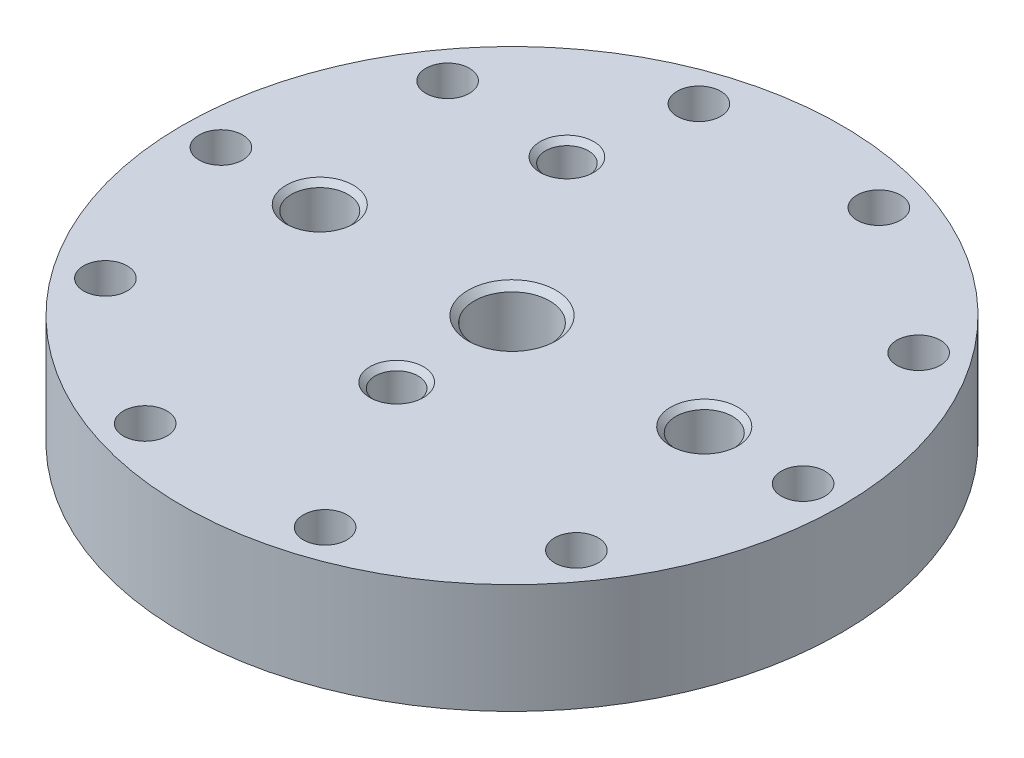
ISO-10303-21;
HEADER;
FILE_DESCRIPTION(('STEP AP214'),'2;1');
FILE_NAME('part.step','',(''),(''),'','','');
FILE_SCHEMA(('AUTOMOTIVE_DESIGN { 1 0 10303 214 1 1 1 1 }'));
ENDSEC;
DATA;
#1=APPLICATION_CONTEXT('core data for automotive mechanical design processes');
#2=APPLICATION_PROTOCOL_DEFINITION('international standard','automotive_design',2000,#1);
#3=PRODUCT_CONTEXT('',#1,'mechanical');
#4=PRODUCT('Part','Part','',(#3));
#5=PRODUCT_RELATED_PRODUCT_CATEGORY('part','',(#4));
#6=PRODUCT_DEFINITION_FORMATION('','',#4);
#7=PRODUCT_DEFINITION_CONTEXT('part definition',#1,'design');
#8=PRODUCT_DEFINITION('design','',#6,#7);
#9=PRODUCT_DEFINITION_SHAPE('','',#8);
#10=(LENGTH_UNIT() NAMED_UNIT(*) SI_UNIT(.MILLI.,.METRE.));
#11=(NAMED_UNIT(*) PLANE_ANGLE_UNIT() SI_UNIT($,.RADIAN.));
#12=(NAMED_UNIT(*) SI_UNIT($,.STERADIAN.) SOLID_ANGLE_UNIT());
#13=UNCERTAINTY_MEASURE_WITH_UNIT(LENGTH_MEASURE(1.E-05),#10,'distance_accuracy_value','');
#14=(GEOMETRIC_REPRESENTATION_CONTEXT(3) GLOBAL_UNCERTAINTY_ASSIGNED_CONTEXT((#13)) GLOBAL_UNIT_ASSIGNED_CONTEXT((#10,
#11,#12)) REPRESENTATION_CONTEXT('',''));
#15=CARTESIAN_POINT('',(0.,0.,0.));
#16=DIRECTION('',(0.,0.,1.));
#17=DIRECTION('',(1.,0.,0.));
#18=AXIS2_PLACEMENT_3D('',#15,#16,#17);
#19=CARTESIAN_POINT('',(-76.2,-25.4,0.));
#20=DIRECTION('',(0.,-1.,0.));
#21=DIRECTION('',(1.,0.,0.));
#22=AXIS2_PLACEMENT_3D('',#19,#20,#21);
#23=PLANE('',#22);
#24=CARTESIAN_POINT('',(-20.7999338913771,-25.4,64.015614111827));
#25=DIRECTION('',(0.,1.,0.));
#26=DIRECTION('',(0.,0.,1.));
#27=AXIS2_PLACEMENT_3D('',#24,#25,#26);
#28=CIRCLE('',#27,5.04189999999999);
#29=CARTESIAN_POINT('',(-20.7999338913771,-25.4,69.057514111827));
#30=VERTEX_POINT('',#29);
#31=EDGE_CURVE('E311',#30,#30,#28,.T.);
#32=ORIENTED_EDGE('',*,*,#31,.T.);
#33=EDGE_LOOP('',(#32));
#34=FACE_BOUND('',#33,.T.);
#35=CARTESIAN_POINT('',(-54.4549338913774,-25.4,39.5638253318068));
#36=DIRECTION('',(0.,1.,0.));
#37=DIRECTION('',(0.,0.,1.));
#38=AXIS2_PLACEMENT_3D('',#35,#36,#37);
#39=CIRCLE('',#38,5.04189999999999);
#40=CARTESIAN_POINT('',(-54.4549338913774,-25.4,44.6057253318068));
#41=VERTEX_POINT('',#40);
#42=EDGE_CURVE('E318',#41,#41,#39,.T.);
#43=ORIENTED_EDGE('',*,*,#42,.T.);
#44=EDGE_LOOP('',(#43));
#45=FACE_BOUND('',#44,.T.);
#46=CARTESIAN_POINT('',(-67.31,-25.4,0.));
#47=DIRECTION('',(0.,1.,0.));
#48=DIRECTION('',(0.,0.,1.));
#49=AXIS2_PLACEMENT_3D('',#46,#47,#48);
#50=CIRCLE('',#49,5.04189999999999);
#51=CARTESIAN_POINT('',(-67.31,-25.4,5.04189999999999));
#52=VERTEX_POINT('',#51);
#53=EDGE_CURVE('E326',#52,#52,#50,.T.);
#54=ORIENTED_EDGE('',*,*,#53,.T.);
#55=EDGE_LOOP('',(#54));
#56=FACE_BOUND('',#55,.T.);
#57=CARTESIAN_POINT('',(-54.4549338913779,-25.4,-39.5638253318061));
#58=DIRECTION('',(0.,1.,0.));
#59=DIRECTION('',(0.,0.,1.));
#60=AXIS2_PLACEMENT_3D('',#57,#58,#59);
#61=CIRCLE('',#60,5.04189999999999);
#62=CARTESIAN_POINT('',(-54.4549338913779,-25.4,-34.5219253318061));
#63=VERTEX_POINT('',#62);
#64=EDGE_CURVE('E334',#63,#63,#61,.T.);
#65=ORIENTED_EDGE('',*,*,#64,.T.);
#66=EDGE_LOOP('',(#65));
#67=FACE_BOUND('',#66,.T.);
#68=CARTESIAN_POINT('',(-20.799933891378,-25.4,-64.0156141118267));
#69=DIRECTION('',(0.,1.,0.));
#70=DIRECTION('',(0.,0.,1.));
#71=AXIS2_PLACEMENT_3D('',#68,#69,#70);
#72=CIRCLE('',#71,5.04189999999999);
#73=CARTESIAN_POINT('',(-20.799933891378,-25.4,-58.9737141118267));
#74=VERTEX_POINT('',#73);
#75=EDGE_CURVE('E342',#74,#74,#72,.T.);
#76=ORIENTED_EDGE('',*,*,#75,.T.);
#77=EDGE_LOOP('',(#76));
#78=FACE_BOUND('',#77,.T.);
#79=CARTESIAN_POINT('',(20.7999338913775,-25.4,-64.0156141118268));
#80=DIRECTION('',(0.,1.,0.));
#81=DIRECTION('',(0.,0.,1.));
#82=AXIS2_PLACEMENT_3D('',#79,#80,#81);
#83=CIRCLE('',#82,5.04189999999999);
#84=CARTESIAN_POINT('',(20.7999338913775,-25.4,-58.9737141118269));
#85=VERTEX_POINT('',#84);
#86=EDGE_CURVE('E350',#85,#85,#83,.T.);
#87=ORIENTED_EDGE('',*,*,#86,.T.);
#88=EDGE_LOOP('',(#87));
#89=FACE_BOUND('',#88,.T.);
#90=CARTESIAN_POINT('',(54.4549338913777,-25.4,-39.5638253318064));
#91=DIRECTION('',(0.,1.,0.));
#92=DIRECTION('',(0.,0.,1.));
#93=AXIS2_PLACEMENT_3D('',#90,#91,#92);
#94=CIRCLE('',#93,5.04189999999999);
#95=CARTESIAN_POINT('',(54.4549338913777,-25.4,-34.5219253318065));
#96=VERTEX_POINT('',#95);
#97=EDGE_CURVE('E358',#96,#96,#94,.T.);
#98=ORIENTED_EDGE('',*,*,#97,.T.);
#99=EDGE_LOOP('',(#98));
#100=FACE_BOUND('',#99,.T.);
#101=CARTESIAN_POINT('',(67.31,-25.4,0.));
#102=DIRECTION('',(0.,1.,0.));
#103=DIRECTION('',(0.,0.,1.));
#104=AXIS2_PLACEMENT_3D('',#101,#102,#103);
#105=CIRCLE('',#104,5.04189999999999);
#106=CARTESIAN_POINT('',(67.31,-25.4,5.04189999999999));
#107=VERTEX_POINT('',#106);
#108=EDGE_CURVE('E366',#107,#107,#105,.T.);
#109=ORIENTED_EDGE('',*,*,#108,.T.);
#110=EDGE_LOOP('',(#109));
#111=FACE_BOUND('',#110,.T.);
#112=CARTESIAN_POINT('',(0.,-25.4,0.));
#113=DIRECTION('',(0.,1.,0.));
#114=DIRECTION('',(-1.,0.,0.));
#115=AXIS2_PLACEMENT_3D('',#112,#113,#114);
#116=CIRCLE('',#115,58.8899);
#117=CARTESIAN_POINT('',(-58.8899,-25.4,0.));
#118=VERTEX_POINT('',#117);
#119=EDGE_CURVE('E89',#118,#118,#116,.T.);
#120=ORIENTED_EDGE('',*,*,#119,.T.);
#121=EDGE_LOOP('',(#120));
#122=FACE_BOUND('',#121,.T.);
#123=CARTESIAN_POINT('',(0.,-25.4,0.));
#124=DIRECTION('',(0.,1.,0.));
#125=DIRECTION('',(-1.,0.,0.));
#126=AXIS2_PLACEMENT_3D('',#123,#124,#125);
#127=CIRCLE('',#126,76.2);
#128=CARTESIAN_POINT('',(-76.2,-25.4,0.));
#129=VERTEX_POINT('',#128);
#130=EDGE_CURVE('E93',#129,#129,#127,.T.);
#131=ORIENTED_EDGE('',*,*,#130,.F.);
#132=EDGE_LOOP('',(#131));
#133=FACE_BOUND('',#132,.T.);
#134=CARTESIAN_POINT('',(20.7999338913784,-25.4,64.0156141118266));
#135=DIRECTION('',(0.,1.,0.));
#136=DIRECTION('',(0.,0.,1.));
#137=AXIS2_PLACEMENT_3D('',#134,#135,#136);
#138=CIRCLE('',#137,5.04189999999999);
#139=CARTESIAN_POINT('',(20.7999338913784,-25.4,69.0575141118265));
#140=VERTEX_POINT('',#139);
#141=EDGE_CURVE('E288',#140,#140,#138,.T.);
#142=ORIENTED_EDGE('',*,*,#141,.T.);
#143=EDGE_LOOP('',(#142));
#144=FACE_BOUND('',#143,.T.);
#145=CARTESIAN_POINT('',(54.4549338913782,-25.4,39.5638253318057));
#146=DIRECTION('',(0.,1.,0.));
#147=DIRECTION('',(0.,0.,1.));
#148=AXIS2_PLACEMENT_3D('',#145,#146,#147);
#149=CIRCLE('',#148,5.04189999999999);
#150=CARTESIAN_POINT('',(54.4549338913782,-25.4,44.6057253318056));
#151=VERTEX_POINT('',#150);
#152=EDGE_CURVE('E291',#151,#151,#149,.T.);
#153=ORIENTED_EDGE('',*,*,#152,.T.);
#154=EDGE_LOOP('',(#153));
#155=FACE_BOUND('',#154,.T.);
#156=ADVANCED_FACE('F41',(#34,#45,#56,#67,#78,#89,#100,#111,#122,#133,#144,#155),#23,.T.);
#157=CARTESIAN_POINT('',(-54.8259,-25.4,0.));
#158=DIRECTION('',(0.,-1.,0.));
#159=DIRECTION('',(1.,0.,0.));
#160=AXIS2_PLACEMENT_3D('',#157,#158,#159);
#161=PLANE('',#160);
#162=CARTESIAN_POINT('',(-25.4,-25.4,-38.1));
#163=DIRECTION('',(0.,1.,0.));
#164=DIRECTION('',(0.,0.,1.));
#165=AXIS2_PLACEMENT_3D('',#162,#163,#164);
#166=CIRCLE('',#165,4.96062);
#167=CARTESIAN_POINT('',(-25.4,-25.4,-33.13938));
#168=VERTEX_POINT('',#167);
#169=EDGE_CURVE('E463',#168,#168,#166,.T.);
#170=ORIENTED_EDGE('',*,*,#169,.T.);
#171=EDGE_LOOP('',(#170));
#172=FACE_BOUND('',#171,.T.);
#173=CARTESIAN_POINT('',(-44.45,-25.4,0.));
#174=DIRECTION('',(0.,1.,0.));
#175=DIRECTION('',(0.,0.,1.));
#176=AXIS2_PLACEMENT_3D('',#173,#174,#175);
#177=CIRCLE('',#176,6.54811999999998);
#178=CARTESIAN_POINT('',(-44.45,-25.4,6.54811999999998));
#179=VERTEX_POINT('',#178);
#180=EDGE_CURVE('E378',#179,#179,#177,.T.);
#181=ORIENTED_EDGE('',*,*,#180,.T.);
#182=EDGE_LOOP('',(#181));
#183=FACE_BOUND('',#182,.T.);
#184=CARTESIAN_POINT('',(44.45,-25.4,0.));
#185=DIRECTION('',(0.,1.,0.));
#186=DIRECTION('',(0.,0.,1.));
#187=AXIS2_PLACEMENT_3D('',#184,#185,#186);
#188=CIRCLE('',#187,6.54811999999998);
#189=CARTESIAN_POINT('',(44.45,-25.4,6.54811999999998));
#190=VERTEX_POINT('',#189);
#191=EDGE_CURVE('E78',#190,#190,#188,.T.);
#192=ORIENTED_EDGE('',*,*,#191,.T.);
#193=EDGE_LOOP('',(#192));
#194=FACE_BOUND('',#193,.T.);
#195=CARTESIAN_POINT('',(0.,-25.4,0.));
#196=DIRECTION('',(0.,1.,0.));
#197=DIRECTION('',(-1.,0.,0.));
#198=AXIS2_PLACEMENT_3D('',#195,#196,#197);
#199=CIRCLE('',#198,36.6649);
#200=CARTESIAN_POINT('',(-36.6649,-25.4,0.));
#201=VERTEX_POINT('',#200);
#202=EDGE_CURVE('E10',#201,#201,#199,.T.);
#203=ORIENTED_EDGE('',*,*,#202,.T.);
#204=EDGE_LOOP('',(#203));
#205=FACE_BOUND('',#204,.T.);
#206=CARTESIAN_POINT('',(0.,-25.4,0.));
#207=DIRECTION('',(0.,1.,0.));
#208=DIRECTION('',(-1.,0.,0.));
#209=AXIS2_PLACEMENT_3D('',#206,#207,#208);
#210=CIRCLE('',#209,54.8259);
#211=CARTESIAN_POINT('',(-54.8259,-25.4,0.));
#212=VERTEX_POINT('',#211);
#213=EDGE_CURVE('E62',#212,#212,#210,.T.);
#214=ORIENTED_EDGE('',*,*,#213,.F.);
#215=EDGE_LOOP('',(#214));
#216=FACE_BOUND('',#215,.T.);
#217=ADVANCED_FACE('F43',(#172,#183,#194,#205,#216),#161,.T.);
#218=CARTESIAN_POINT('',(0.,0.,0.));
#219=DIRECTION('',(0.,1.,0.));
#220=DIRECTION('',(-1.,0.,0.));
#221=AXIS2_PLACEMENT_3D('',#218,#219,#220);
#222=CYLINDRICAL_SURFACE('',#221,36.6649);
#223=CARTESIAN_POINT('',(0.,-22.7076,0.));
#224=DIRECTION('',(0.,1.,0.));
#225=DIRECTION('',(-1.,0.,0.));
#226=AXIS2_PLACEMENT_3D('',#223,#224,#225);
#227=CIRCLE('',#226,36.6649);
#228=CARTESIAN_POINT('',(-36.6649,-22.7076,0.));
#229=VERTEX_POINT('',#228);
#230=EDGE_CURVE('E50',#229,#229,#227,.T.);
#231=ORIENTED_EDGE('',*,*,#230,.T.);
#232=EDGE_LOOP('',(#231));
#233=FACE_BOUND('',#232,.T.);
#234=ORIENTED_EDGE('',*,*,#202,.F.);
#235=EDGE_LOOP('',(#234));
#236=FACE_BOUND('',#235,.T.);
#237=ADVANCED_FACE('F135',(#233,#236),#222,.F.);
#238=CARTESIAN_POINT('',(-36.6649,-22.7076,0.));
#239=DIRECTION('',(0.,-1.,0.));
#240=DIRECTION('',(1.,0.,0.));
#241=AXIS2_PLACEMENT_3D('',#238,#239,#240);
#242=PLANE('',#241);
#243=CARTESIAN_POINT('',(0.,-22.7076,0.));
#244=DIRECTION('',(0.,1.,0.));
#245=DIRECTION('',(-1.,0.,0.));
#246=AXIS2_PLACEMENT_3D('',#243,#244,#245);
#247=CIRCLE('',#246,32.6009);
#248=CARTESIAN_POINT('',(-32.6009,-22.7076,0.));
#249=VERTEX_POINT('',#248);
#250=EDGE_CURVE('E56',#249,#249,#247,.T.);
#251=ORIENTED_EDGE('',*,*,#250,.T.);
#252=EDGE_LOOP('',(#251));
#253=FACE_BOUND('',#252,.T.);
#254=ORIENTED_EDGE('',*,*,#230,.F.);
#255=EDGE_LOOP('',(#254));
#256=FACE_BOUND('',#255,.T.);
#257=ADVANCED_FACE('F120',(#253,#256),#242,.T.);
#258=CARTESIAN_POINT('',(0.,0.,0.));
#259=DIRECTION('',(0.,1.,0.));
#260=DIRECTION('',(-1.,0.,0.));
#261=AXIS2_PLACEMENT_3D('',#258,#259,#260);
#262=CYLINDRICAL_SURFACE('',#261,32.6009);
#263=CARTESIAN_POINT('',(0.,-25.4,0.));
#264=DIRECTION('',(0.,1.,0.));
#265=DIRECTION('',(-1.,0.,0.));
#266=AXIS2_PLACEMENT_3D('',#263,#264,#265);
#267=CIRCLE('',#266,32.6009);
#268=CARTESIAN_POINT('',(-32.6009,-25.4,0.));
#269=VERTEX_POINT('',#268);
#270=EDGE_CURVE('E113',#269,#269,#267,.T.);
#271=ORIENTED_EDGE('',*,*,#270,.T.);
#272=EDGE_LOOP('',(#271));
#273=FACE_BOUND('',#272,.T.);
#274=ORIENTED_EDGE('',*,*,#250,.F.);
#275=EDGE_LOOP('',(#274));
#276=FACE_BOUND('',#275,.T.);
#277=ADVANCED_FACE('F123',(#273,#276),#262,.T.);
#278=CARTESIAN_POINT('',(-32.6009,-25.4,0.));
#279=DIRECTION('',(0.,-1.,0.));
#280=DIRECTION('',(1.,0.,0.));
#281=AXIS2_PLACEMENT_3D('',#278,#279,#280);
#282=PLANE('',#281);
#283=CARTESIAN_POINT('',(0.,-25.4,0.));
#284=DIRECTION('',(0.,1.,0.));
#285=DIRECTION('',(-1.,0.,0.));
#286=AXIS2_PLACEMENT_3D('',#283,#284,#285);
#287=CIRCLE('',#286,31.0134);
#288=CARTESIAN_POINT('',(-31.0134,-25.4,0.));
#289=VERTEX_POINT('',#288);
#290=EDGE_CURVE('E109',#289,#289,#287,.T.);
#291=ORIENTED_EDGE('',*,*,#290,.T.);
#292=EDGE_LOOP('',(#291));
#293=FACE_BOUND('',#292,.T.);
#294=ORIENTED_EDGE('',*,*,#270,.F.);
#295=EDGE_LOOP('',(#294));
#296=FACE_BOUND('',#295,.T.);
#297=ADVANCED_FACE('F125',(#293,#296),#282,.T.);
#298=CARTESIAN_POINT('',(0.,0.,0.));
#299=DIRECTION('',(0.,1.,0.));
#300=DIRECTION('',(-1.,0.,0.));
#301=AXIS2_PLACEMENT_3D('',#298,#299,#300);
#302=CYLINDRICAL_SURFACE('',#301,31.0134);
#303=CARTESIAN_POINT('',(0.,-24.765,0.));
#304=DIRECTION('',(0.,1.,0.));
#305=DIRECTION('',(-1.,0.,0.));
#306=AXIS2_PLACEMENT_3D('',#303,#304,#305);
#307=CIRCLE('',#306,31.0134);
#308=CARTESIAN_POINT('',(-31.0134,-24.765,0.));
#309=VERTEX_POINT('',#308);
#310=EDGE_CURVE('E105',#309,#309,#307,.T.);
#311=ORIENTED_EDGE('',*,*,#310,.T.);
#312=EDGE_LOOP('',(#311));
#313=FACE_BOUND('',#312,.T.);
#314=ORIENTED_EDGE('',*,*,#290,.F.);
#315=EDGE_LOOP('',(#314));
#316=FACE_BOUND('',#315,.T.);
#317=ADVANCED_FACE('F132',(#313,#316),#302,.F.);
#318=CARTESIAN_POINT('',(0.,-24.765,0.));
#319=DIRECTION('',(0.,-1.,0.));
#320=DIRECTION('',(1.,0.,0.));
#321=AXIS2_PLACEMENT_3D('',#318,#319,#320);
#322=CONICAL_SURFACE('',#321,31.0134,1.32820785929553);
#323=CARTESIAN_POINT('',(-2.29230840469002,-23.1730578467666,24.4731943086755));
#324=CARTESIAN_POINT('',(-2.17148648907797,-23.1392092408368,24.3471283464952));
#325=CARTESIAN_POINT('',(-2.03986401074742,-23.1076504842786,24.2306545146319));
#326=CARTESIAN_POINT('',(-1.75828040896983,-23.050331005527,24.0204753739261));
#327=CARTESIAN_POINT('',(-1.60830442164899,-23.0245750314058,23.9267887055147));
#328=CARTESIAN_POINT('',(-1.29387707163479,-22.9799403986388,23.7652167316157));
#329=CARTESIAN_POINT('',(-1.12941187161248,-22.961068404617,23.6973564268028));
#330=CARTESIAN_POINT('',(-0.790838675048444,-22.9311116002462,23.5899468317939));
#331=CARTESIAN_POINT('',(-0.616733420442404,-22.9200245877534,23.5503895354443));
#332=CARTESIAN_POINT('',(-0.267974378561557,-22.9063235615343,23.5015417841057));
#333=CARTESIAN_POINT('',(-0.0934194884629469,-22.9035260327082,23.4915957617524));
#334=CARTESIAN_POINT('',(0.254894346947091,-22.9060152293265,23.5004576513084));
#335=CARTESIAN_POINT('',(0.428653340733291,-22.9113014556752,23.5192637880428));
#336=CARTESIAN_POINT('',(0.768175811843403,-22.9295878537462,23.5845430936928));
#337=CARTESIAN_POINT('',(0.934012414886317,-22.9424900595036,23.6306649197413));
#338=CARTESIAN_POINT('',(1.25546159470996,-22.9753493831642,23.7487391736544));
#339=CARTESIAN_POINT('',(1.41107369788114,-22.9953068276006,23.8206927970785));
#340=CARTESIAN_POINT('',(1.71016360369182,-23.0417734712303,23.9893538821773));
#341=CARTESIAN_POINT('',(1.85343510448676,-23.0683726254506,24.0864019230407));
#342=CARTESIAN_POINT('',(2.12172246757999,-23.1269238833087,24.301767881886));
#343=CARTESIAN_POINT('',(2.24673567298875,-23.1588767645541,24.4200888898651));
#344=CARTESIAN_POINT('',(2.47922755996233,-23.2280893531446,24.6787083235075));
#345=CARTESIAN_POINT('',(2.58601909877022,-23.265485906537,24.8195877502691));
#346=CARTESIAN_POINT('',(2.77451932254076,-23.3435008839784,25.1164251995025));
#347=CARTESIAN_POINT('',(2.85622379609809,-23.38411984754,25.272385747894));
#348=CARTESIAN_POINT('',(2.99485289023039,-23.4686638282191,25.6003420162143));
#349=CARTESIAN_POINT('',(3.05090535964434,-23.5126529390705,25.772690252568));
#350=CARTESIAN_POINT('',(3.1329412004748,-23.6014312902681,26.1242083224166));
#351=CARTESIAN_POINT('',(3.15892112239828,-23.6462206218058,26.3033789360431));
#352=CARTESIAN_POINT('',(3.18029964827097,-23.7361377161826,26.6667703776667));
#353=CARTESIAN_POINT('',(3.1751615958425,-23.781257935653,26.8510249568165));
#354=CARTESIAN_POINT('',(3.13304944785652,-23.8698283706818,27.2162806379597));
#355=CARTESIAN_POINT('',(3.09607485212284,-23.9132785599916,27.397281688792));
#356=CARTESIAN_POINT('',(2.99121868244847,-23.9972636714213,27.7503016855857));
#357=CARTESIAN_POINT('',(2.92341571290874,-24.0378057060487,27.9223422425952));
#358=CARTESIAN_POINT('',(2.75855697929699,-24.1150461325221,28.252739118955));
#359=CARTESIAN_POINT('',(2.66150371452105,-24.1517448523998,28.4110966059704));
#360=CARTESIAN_POINT('',(2.44272912190508,-24.2197097540351,28.7063785870681));
#361=CARTESIAN_POINT('',(2.3214975444225,-24.2510639028007,28.8436454899462));
#362=CARTESIAN_POINT('',(2.05656644547157,-24.308349912464,29.0958170552049));
#363=CARTESIAN_POINT('',(1.91287011435473,-24.334282542083,29.2107248877349));
#364=CARTESIAN_POINT('',(1.61098720776672,-24.3794715379119,29.4117887902025));
#365=CARTESIAN_POINT('',(1.45325795515829,-24.3988799038485,29.498597400542));
#366=CARTESIAN_POINT('',(1.12485855300491,-24.4314095136325,29.6444893016907));
#367=CARTESIAN_POINT('',(0.954190160270893,-24.4445316092334,29.7035763485904));
#368=CARTESIAN_POINT('',(0.608783590355999,-24.4639354547464,29.7910664754728));
#369=CARTESIAN_POINT('',(0.434216132062682,-24.4703605715953,29.8201125537052));
#370=CARTESIAN_POINT('',(0.0825694970300175,-24.4767116755465,29.848823582378));
#371=CARTESIAN_POINT('',(-0.0945094772550278,-24.4766381835604,29.8484908877449));
#372=CARTESIAN_POINT('',(-0.444090148449614,-24.4700317347515,29.8186264738164));
#373=CARTESIAN_POINT('',(-0.616620769770389,-24.4635698496211,29.7894160233155));
#374=CARTESIAN_POINT('',(-0.954230969301868,-24.4444520327182,29.703219575666));
#375=CARTESIAN_POINT('',(-1.11931059946631,-24.4317961441422,29.64623377222));
#376=CARTESIAN_POINT('',(-1.43794713184651,-24.4005493666126,29.5060749938696));
#377=CARTESIAN_POINT('',(-1.59146688981764,-24.3819402767098,29.422821721299));
#378=CARTESIAN_POINT('',(-1.8822998866556,-24.3392449253113,29.2327633249115));
#379=CARTESIAN_POINT('',(-2.01961207868009,-24.3151583103174,29.1259566810653));
#380=CARTESIAN_POINT('',(-2.27653630090332,-24.2616475519893,28.8901118218242));
#381=CARTESIAN_POINT('',(-2.39583148434271,-24.2321444862647,28.7607465287182));
#382=CARTESIAN_POINT('',(-2.61107155401954,-24.1687626216808,28.4848164226081));
#383=CARTESIAN_POINT('',(-2.70701378092179,-24.1348833251468,28.3382496535873));
#384=CARTESIAN_POINT('',(-2.87526668409187,-24.0626838948059,28.0284088643456));
#385=CARTESIAN_POINT('',(-2.94696126762735,-24.0242773282572,27.8648204688587));
#386=CARTESIAN_POINT('',(-3.06186541163014,-23.9446250057293,27.5285917986924));
#387=CARTESIAN_POINT('',(-3.10507237412049,-23.9033789911806,27.3559506999857));
#388=CARTESIAN_POINT('',(-3.16277621753206,-23.8180455255398,27.0021806359135));
#389=CARTESIAN_POINT('',(-3.17656999716895,-23.7739139459994,26.8209474951682));
#390=CARTESIAN_POINT('',(-3.17314523422187,-23.6848538644246,26.4589152860549));
#391=CARTESIAN_POINT('',(-3.15591623977573,-23.6399250988605,26.2781163845365));
#392=CARTESIAN_POINT('',(-3.09044899958947,-23.5498430035928,25.9193299763386));
#393=CARTESIAN_POINT('',(-3.04175330826662,-23.5046962745123,25.7414242924379));
#394=CARTESIAN_POINT('',(-2.91417904358197,-23.4162486062881,25.3964472069703));
#395=CARTESIAN_POINT('',(-2.83533373004028,-23.3729456914187,25.2293641030526));
#396=CARTESIAN_POINT('',(-2.67971417660669,-23.3031298480503,24.9625748888745));
#397=CARTESIAN_POINT('',(-2.61055563687989,-23.275724999231,24.8585865798521));
#398=CARTESIAN_POINT('',(-2.46022294935849,-23.2228393369198,24.6591491004832));
#399=CARTESIAN_POINT('',(-2.37904904208698,-23.1973584849288,24.5636997592652));
#400=CARTESIAN_POINT('',(-2.29230840469002,-23.1730578467666,24.4731943086755));
#401=B_SPLINE_CURVE_WITH_KNOTS('',3,(#323,#324,#325,#326,#327,#328,#329,#330,#331,#332,#333,
#334,#335,#336,#337,#338,#339,#340,#341,#342,#343,#344,#345,#346,#347,#348,#349,#350,#351,#352,
#353,#354,#355,#356,#357,#358,#359,#360,#361,#362,#363,#364,#365,#366,#367,#368,#369,#370,#371,
#372,#373,#374,#375,#376,#377,#378,#379,#380,#381,#382,#383,#384,#385,#386,#387,#388,#389,#390,
#391,#392,#393,#394,#395,#396,#397,#398,#399,#400),.UNSPECIFIED.,.T.,.F.,(4,2,2,2,2,2,2,2,2,2,2,
2,2,2,2,2,2,2,2,2,2,2,2,2,2,2,2,2,2,2,2,2,2,2,2,2,2,2,4),(0.,0.533153275903216,1.06674122778237,
1.60084440246926,2.13479643405464,2.65683593534366,3.17884320691535,3.69427777611123,
4.20973620396929,4.73259551518889,5.25553083560085,5.79515961435619,6.33487893198336,
6.89178884964486,7.44876264172783,8.01536896727597,8.58198419480039,9.14716273193406,
9.71229299098361,10.2669648464088,10.8215580010657,11.3621520447471,11.9026728203048,
12.4313685391609,12.9600218791739,13.4828593216862,14.0056931180314,14.5301409208862,
15.0546225791694,15.5874601370697,16.1203583438833,16.6659266065046,17.2115446162707,
17.7700654492779,18.3287744883768,18.8957942356511,19.4621902662934,19.844960067556,
20.2277222075854),.UNSPECIFIED.);
#402=CARTESIAN_POINT('',(-2.29230840469002,-23.1730578467666,24.4731943086755));
#403=VERTEX_POINT('',#402);
#404=EDGE_CURVE('E168',#403,#403,#401,.T.);
#405=ORIENTED_EDGE('',*,*,#404,.F.);
#406=EDGE_LOOP('',(#405));
#407=FACE_BOUND('',#406,.T.);
#408=CARTESIAN_POINT('',(0.,-19.812,0.));
#409=DIRECTION('',(0.,1.,0.));
#410=DIRECTION('',(-1.,0.,0.));
#411=AXIS2_PLACEMENT_3D('',#408,#409,#410);
#412=CIRCLE('',#411,10.9982);
#413=CARTESIAN_POINT('',(-10.9982,-19.812,0.));
#414=VERTEX_POINT('',#413);
#415=EDGE_CURVE('E101',#414,#414,#412,.T.);
#416=ORIENTED_EDGE('',*,*,#415,.T.);
#417=EDGE_LOOP('',(#416));
#418=FACE_BOUND('',#417,.T.);
#419=ORIENTED_EDGE('',*,*,#310,.F.);
#420=EDGE_LOOP('',(#419));
#421=FACE_BOUND('',#420,.T.);
#422=ADVANCED_FACE('F161',(#407,#418,#421),#322,.F.);
#423=CARTESIAN_POINT('',(0.,-19.812,0.));
#424=DIRECTION('',(0.,-1.,0.));
#425=DIRECTION('',(1.,0.,0.));
#426=AXIS2_PLACEMENT_3D('',#423,#424,#425);
#427=CONICAL_SURFACE('',#426,10.9982,1.0471975511966);
#428=CARTESIAN_POINT('',(0.,-18.5031758072606,0.));
#429=DIRECTION('',(0.,-1.,0.));
#430=DIRECTION('',(1.,0.,0.));
#431=AXIS2_PLACEMENT_3D('',#428,#429,#430);
#432=CIRCLE('',#431,8.73125);
#433=CARTESIAN_POINT('',(8.73125,-18.5031758072606,0.));
#434=VERTEX_POINT('',#433);
#435=EDGE_CURVE('E59',#434,#434,#432,.T.);
#436=ORIENTED_EDGE('',*,*,#435,.F.);
#437=EDGE_LOOP('',(#436));
#438=FACE_BOUND('',#437,.T.);
#439=ORIENTED_EDGE('',*,*,#415,.F.);
#440=EDGE_LOOP('',(#439));
#441=FACE_BOUND('',#440,.T.);
#442=ADVANCED_FACE('F157',(#438,#441),#427,.F.);
#443=CARTESIAN_POINT('',(0.,0.,0.));
#444=DIRECTION('',(0.,1.,0.));
#445=DIRECTION('',(-1.,0.,0.));
#446=AXIS2_PLACEMENT_3D('',#443,#444,#445);
#447=PLANE('',#446);
#448=CARTESIAN_POINT('',(-25.4,0.,-38.1));
#449=DIRECTION('',(0.,1.,0.));
#450=DIRECTION('',(0.,0.,1.));
#451=AXIS2_PLACEMENT_3D('',#448,#449,#450);
#452=CIRCLE('',#451,6.19125);
#453=CARTESIAN_POINT('',(-25.4,0.,-31.90875));
#454=VERTEX_POINT('',#453);
#455=EDGE_CURVE('E176',#454,#454,#452,.T.);
#456=ORIENTED_EDGE('',*,*,#455,.F.);
#457=EDGE_LOOP('',(#456));
#458=FACE_BOUND('',#457,.T.);
#459=CARTESIAN_POINT('',(0.,0.,26.67));
#460=DIRECTION('',(0.,1.,0.));
#461=DIRECTION('',(0.,0.,1.));
#462=AXIS2_PLACEMENT_3D('',#459,#460,#461);
#463=CIRCLE('',#462,6.19125);
#464=CARTESIAN_POINT('',(0.,0.,32.86125));
#465=VERTEX_POINT('',#464);
#466=EDGE_CURVE('E459',#465,#465,#463,.T.);
#467=ORIENTED_EDGE('',*,*,#466,.F.);
#468=EDGE_LOOP('',(#467));
#469=FACE_BOUND('',#468,.T.);
#470=CARTESIAN_POINT('',(54.4549338913782,0.,39.5638253318057));
#471=DIRECTION('',(0.,1.,0.));
#472=DIRECTION('',(0.,0.,1.));
#473=AXIS2_PLACEMENT_3D('',#470,#471,#472);
#474=CIRCLE('',#473,5.04189999999999);
#475=CARTESIAN_POINT('',(54.4549338913782,0.,44.6057253318056));
#476=VERTEX_POINT('',#475);
#477=EDGE_CURVE('E294',#476,#476,#474,.T.);
#478=ORIENTED_EDGE('',*,*,#477,.F.);
#479=EDGE_LOOP('',(#478));
#480=FACE_BOUND('',#479,.T.);
#481=CARTESIAN_POINT('',(20.7999338913784,0.,64.0156141118266));
#482=DIRECTION('',(0.,1.,0.));
#483=DIRECTION('',(0.,0.,1.));
#484=AXIS2_PLACEMENT_3D('',#481,#482,#483);
#485=CIRCLE('',#484,5.04189999999999);
#486=CARTESIAN_POINT('',(20.7999338913784,0.,69.0575141118265));
#487=VERTEX_POINT('',#486);
#488=EDGE_CURVE('E293',#487,#487,#485,.T.);
#489=ORIENTED_EDGE('',*,*,#488,.F.);
#490=EDGE_LOOP('',(#489));
#491=FACE_BOUND('',#490,.T.);
#492=CARTESIAN_POINT('',(-20.7999338913771,0.,64.015614111827));
#493=DIRECTION('',(0.,1.,0.));
#494=DIRECTION('',(0.,0.,1.));
#495=AXIS2_PLACEMENT_3D('',#492,#493,#494);
#496=CIRCLE('',#495,5.04189999999999);
#497=CARTESIAN_POINT('',(-20.7999338913771,0.,69.057514111827));
#498=VERTEX_POINT('',#497);
#499=EDGE_CURVE('E307',#498,#498,#496,.T.);
#500=ORIENTED_EDGE('',*,*,#499,.F.);
#501=EDGE_LOOP('',(#500));
#502=FACE_BOUND('',#501,.T.);
#503=CARTESIAN_POINT('',(-54.4549338913774,0.,39.5638253318068));
#504=DIRECTION('',(0.,1.,0.));
#505=DIRECTION('',(0.,0.,1.));
#506=AXIS2_PLACEMENT_3D('',#503,#504,#505);
#507=CIRCLE('',#506,5.04189999999999);
#508=CARTESIAN_POINT('',(-54.4549338913774,0.,44.6057253318068));
#509=VERTEX_POINT('',#508);
#510=EDGE_CURVE('E314',#509,#509,#507,.T.);
#511=ORIENTED_EDGE('',*,*,#510,.F.);
#512=EDGE_LOOP('',(#511));
#513=FACE_BOUND('',#512,.T.);
#514=CARTESIAN_POINT('',(-67.31,0.,0.));
#515=DIRECTION('',(0.,1.,0.));
#516=DIRECTION('',(0.,0.,1.));
#517=AXIS2_PLACEMENT_3D('',#514,#515,#516);
#518=CIRCLE('',#517,5.04189999999999);
#519=CARTESIAN_POINT('',(-67.31,0.,5.04189999999999));
#520=VERTEX_POINT('',#519);
#521=EDGE_CURVE('E322',#520,#520,#518,.T.);
#522=ORIENTED_EDGE('',*,*,#521,.F.);
#523=EDGE_LOOP('',(#522));
#524=FACE_BOUND('',#523,.T.);
#525=CARTESIAN_POINT('',(-54.4549338913779,0.,-39.5638253318061));
#526=DIRECTION('',(0.,1.,0.));
#527=DIRECTION('',(0.,0.,1.));
#528=AXIS2_PLACEMENT_3D('',#525,#526,#527);
#529=CIRCLE('',#528,5.04189999999999);
#530=CARTESIAN_POINT('',(-54.4549338913779,0.,-34.5219253318061));
#531=VERTEX_POINT('',#530);
#532=EDGE_CURVE('E330',#531,#531,#529,.T.);
#533=ORIENTED_EDGE('',*,*,#532,.F.);
#534=EDGE_LOOP('',(#533));
#535=FACE_BOUND('',#534,.T.);
#536=CARTESIAN_POINT('',(-20.799933891378,0.,-64.0156141118267));
#537=DIRECTION('',(0.,1.,0.));
#538=DIRECTION('',(0.,0.,1.));
#539=AXIS2_PLACEMENT_3D('',#536,#537,#538);
#540=CIRCLE('',#539,5.04189999999999);
#541=CARTESIAN_POINT('',(-20.799933891378,0.,-58.9737141118267));
#542=VERTEX_POINT('',#541);
#543=EDGE_CURVE('E338',#542,#542,#540,.T.);
#544=ORIENTED_EDGE('',*,*,#543,.F.);
#545=EDGE_LOOP('',(#544));
#546=FACE_BOUND('',#545,.T.);
#547=CARTESIAN_POINT('',(20.7999338913775,0.,-64.0156141118268));
#548=DIRECTION('',(0.,1.,0.));
#549=DIRECTION('',(0.,0.,1.));
#550=AXIS2_PLACEMENT_3D('',#547,#548,#549);
#551=CIRCLE('',#550,5.04189999999999);
#552=CARTESIAN_POINT('',(20.7999338913775,0.,-58.9737141118269));
#553=VERTEX_POINT('',#552);
#554=EDGE_CURVE('E346',#553,#553,#551,.T.);
#555=ORIENTED_EDGE('',*,*,#554,.F.);
#556=EDGE_LOOP('',(#555));
#557=FACE_BOUND('',#556,.T.);
#558=CARTESIAN_POINT('',(54.4549338913777,0.,-39.5638253318064));
#559=DIRECTION('',(0.,1.,0.));
#560=DIRECTION('',(0.,0.,1.));
#561=AXIS2_PLACEMENT_3D('',#558,#559,#560);
#562=CIRCLE('',#561,5.04189999999999);
#563=CARTESIAN_POINT('',(54.4549338913777,0.,-34.5219253318065));
#564=VERTEX_POINT('',#563);
#565=EDGE_CURVE('E354',#564,#564,#562,.T.);
#566=ORIENTED_EDGE('',*,*,#565,.F.);
#567=EDGE_LOOP('',(#566));
#568=FACE_BOUND('',#567,.T.);
#569=CARTESIAN_POINT('',(67.31,0.,0.));
#570=DIRECTION('',(0.,1.,0.));
#571=DIRECTION('',(0.,0.,1.));
#572=AXIS2_PLACEMENT_3D('',#569,#570,#571);
#573=CIRCLE('',#572,5.0419);
#574=CARTESIAN_POINT('',(67.31,0.,5.0419));
#575=VERTEX_POINT('',#574);
#576=EDGE_CURVE('E362',#575,#575,#573,.T.);
#577=ORIENTED_EDGE('',*,*,#576,.F.);
#578=EDGE_LOOP('',(#577));
#579=FACE_BOUND('',#578,.T.);
#580=CARTESIAN_POINT('',(-44.45,0.,0.));
#581=DIRECTION('',(0.,1.,0.));
#582=DIRECTION('',(0.,0.,1.));
#583=AXIS2_PLACEMENT_3D('',#580,#581,#582);
#584=CIRCLE('',#583,7.77875);
#585=CARTESIAN_POINT('',(-44.45,0.,7.77875));
#586=VERTEX_POINT('',#585);
#587=EDGE_CURVE('E370',#586,#586,#584,.T.);
#588=ORIENTED_EDGE('',*,*,#587,.F.);
#589=EDGE_LOOP('',(#588));
#590=FACE_BOUND('',#589,.T.);
#591=CARTESIAN_POINT('',(44.45,0.,0.));
#592=DIRECTION('',(0.,1.,0.));
#593=DIRECTION('',(0.,0.,1.));
#594=AXIS2_PLACEMENT_3D('',#591,#592,#593);
#595=CIRCLE('',#594,7.77875);
#596=CARTESIAN_POINT('',(44.45,0.,7.77875));
#597=VERTEX_POINT('',#596);
#598=EDGE_CURVE('E382',#597,#597,#595,.T.);
#599=ORIENTED_EDGE('',*,*,#598,.F.);
#600=EDGE_LOOP('',(#599));
#601=FACE_BOUND('',#600,.T.);
#602=CARTESIAN_POINT('',(0.,0.,0.));
#603=DIRECTION('',(0.,1.,0.));
#604=DIRECTION('',(0.,0.,1.));
#605=AXIS2_PLACEMENT_3D('',#602,#603,#604);
#606=CIRCLE('',#605,10.16);
#607=CARTESIAN_POINT('',(0.,0.,10.16));
#608=VERTEX_POINT('',#607);
#609=EDGE_CURVE('E72',#608,#608,#606,.T.);
#610=ORIENTED_EDGE('',*,*,#609,.F.);
#611=EDGE_LOOP('',(#610));
#612=FACE_BOUND('',#611,.T.);
#613=CARTESIAN_POINT('',(0.,0.,0.));
#614=DIRECTION('',(0.,1.,0.));
#615=DIRECTION('',(-1.,0.,0.));
#616=AXIS2_PLACEMENT_3D('',#613,#614,#615);
#617=CIRCLE('',#616,76.2);
#618=CARTESIAN_POINT('',(-76.2,0.,0.));
#619=VERTEX_POINT('',#618);
#620=EDGE_CURVE('E97',#619,#619,#617,.T.);
#621=ORIENTED_EDGE('',*,*,#620,.T.);
#622=EDGE_LOOP('',(#621));
#623=FACE_BOUND('',#622,.T.);
#624=ADVANCED_FACE('F153',(#458,#469,#480,#491,#502,#513,#524,#535,#546,#557,#568,#579,#590,
#601,#612,#623),#447,.T.);
#625=CARTESIAN_POINT('',(0.,0.,0.));
#626=DIRECTION('',(0.,1.,0.));
#627=DIRECTION('',(-1.,0.,0.));
#628=AXIS2_PLACEMENT_3D('',#625,#626,#627);
#629=CYLINDRICAL_SURFACE('',#628,76.2);
#630=ORIENTED_EDGE('',*,*,#130,.T.);
#631=EDGE_LOOP('',(#630));
#632=FACE_BOUND('',#631,.T.);
#633=ORIENTED_EDGE('',*,*,#620,.F.);
#634=EDGE_LOOP('',(#633));
#635=FACE_BOUND('',#634,.T.);
#636=ADVANCED_FACE('F150',(#632,#635),#629,.T.);
#637=CARTESIAN_POINT('',(0.,0.,0.));
#638=DIRECTION('',(0.,1.,0.));
#639=DIRECTION('',(-1.,0.,0.));
#640=AXIS2_PLACEMENT_3D('',#637,#638,#639);
#641=CYLINDRICAL_SURFACE('',#640,58.8899);
#642=CARTESIAN_POINT('',(0.,-22.7076,0.));
#643=DIRECTION('',(0.,1.,0.));
#644=DIRECTION('',(-1.,0.,0.));
#645=AXIS2_PLACEMENT_3D('',#642,#643,#644);
#646=CIRCLE('',#645,58.8899);
#647=CARTESIAN_POINT('',(-58.8899,-22.7076,0.));
#648=VERTEX_POINT('',#647);
#649=EDGE_CURVE('E85',#648,#648,#646,.T.);
#650=ORIENTED_EDGE('',*,*,#649,.T.);
#651=EDGE_LOOP('',(#650));
#652=FACE_BOUND('',#651,.T.);
#653=ORIENTED_EDGE('',*,*,#119,.F.);
#654=EDGE_LOOP('',(#653));
#655=FACE_BOUND('',#654,.T.);
#656=ADVANCED_FACE('F148',(#652,#655),#641,.F.);
#657=CARTESIAN_POINT('',(-58.8899,-22.7076,0.));
#658=DIRECTION('',(0.,-1.,0.));
#659=DIRECTION('',(1.,0.,0.));
#660=AXIS2_PLACEMENT_3D('',#657,#658,#659);
#661=PLANE('',#660);
#662=CARTESIAN_POINT('',(0.,-22.7076,0.));
#663=DIRECTION('',(0.,1.,0.));
#664=DIRECTION('',(-1.,0.,0.));
#665=AXIS2_PLACEMENT_3D('',#662,#663,#664);
#666=CIRCLE('',#665,54.8259);
#667=CARTESIAN_POINT('',(-54.8259,-22.7076,0.));
#668=VERTEX_POINT('',#667);
#669=EDGE_CURVE('E69',#668,#668,#666,.T.);
#670=ORIENTED_EDGE('',*,*,#669,.T.);
#671=EDGE_LOOP('',(#670));
#672=FACE_BOUND('',#671,.T.);
#673=ORIENTED_EDGE('',*,*,#649,.F.);
#674=EDGE_LOOP('',(#673));
#675=FACE_BOUND('',#674,.T.);
#676=ADVANCED_FACE('F268',(#672,#675),#661,.T.);
#677=CARTESIAN_POINT('',(0.,0.,0.));
#678=DIRECTION('',(0.,1.,0.));
#679=DIRECTION('',(-1.,0.,0.));
#680=AXIS2_PLACEMENT_3D('',#677,#678,#679);
#681=CYLINDRICAL_SURFACE('',#680,54.8259);
#682=ORIENTED_EDGE('',*,*,#213,.T.);
#683=EDGE_LOOP('',(#682));
#684=FACE_BOUND('',#683,.T.);
#685=ORIENTED_EDGE('',*,*,#669,.F.);
#686=EDGE_LOOP('',(#685));
#687=FACE_BOUND('',#686,.T.);
#688=ADVANCED_FACE('F266',(#684,#687),#681,.T.);
#689=CARTESIAN_POINT('',(0.,0.,0.));
#690=DIRECTION('',(0.,1.,0.));
#691=DIRECTION('',(0.,0.,1.));
#692=AXIS2_PLACEMENT_3D('',#689,#690,#691);
#693=CYLINDRICAL_SURFACE('',#692,8.73125);
#694=ORIENTED_EDGE('',*,*,#435,.T.);
#695=EDGE_LOOP('',(#694));
#696=FACE_BOUND('',#695,.T.);
#697=CARTESIAN_POINT('',(0.,-1.42875000000001,0.));
#698=DIRECTION('',(0.,1.,0.));
#699=DIRECTION('',(0.,0.,1.));
#700=AXIS2_PLACEMENT_3D('',#697,#698,#699);
#701=CIRCLE('',#700,8.73125);
#702=CARTESIAN_POINT('',(0.,-1.42875000000001,8.73125));
#703=VERTEX_POINT('',#702);
#704=EDGE_CURVE('E63',#703,#703,#701,.T.);
#705=ORIENTED_EDGE('',*,*,#704,.T.);
#706=EDGE_LOOP('',(#705));
#707=FACE_BOUND('',#706,.T.);
#708=ADVANCED_FACE('F262',(#696,#707),#693,.F.);
#709=CARTESIAN_POINT('',(0.,0.,0.));
#710=DIRECTION('',(0.,1.,0.));
#711=DIRECTION('',(0.,0.,1.));
#712=AXIS2_PLACEMENT_3D('',#709,#710,#711);
#713=CONICAL_SURFACE('',#712,10.16,0.785398163397448);
#714=ORIENTED_EDGE('',*,*,#704,.F.);
#715=EDGE_LOOP('',(#714));
#716=FACE_BOUND('',#715,.T.);
#717=ORIENTED_EDGE('',*,*,#609,.T.);
#718=EDGE_LOOP('',(#717));
#719=FACE_BOUND('',#718,.T.);
#720=ADVANCED_FACE('F258',(#716,#719),#713,.F.);
#721=CARTESIAN_POINT('',(44.45,0.,0.));
#722=DIRECTION('',(0.,1.,0.));
#723=DIRECTION('',(0.,0.,1.));
#724=AXIS2_PLACEMENT_3D('',#721,#722,#723);
#725=CYLINDRICAL_SURFACE('',#724,6.54811999999999);
#726=ORIENTED_EDGE('',*,*,#191,.F.);
#727=EDGE_LOOP('',(#726));
#728=FACE_BOUND('',#727,.T.);
#729=CARTESIAN_POINT('',(44.45,-1.23063,0.));
#730=DIRECTION('',(0.,1.,0.));
#731=DIRECTION('',(0.,0.,1.));
#732=AXIS2_PLACEMENT_3D('',#729,#730,#731);
#733=CIRCLE('',#732,6.54812);
#734=CARTESIAN_POINT('',(44.45,-1.23063,6.54812));
#735=VERTEX_POINT('',#734);
#736=EDGE_CURVE('E386',#735,#735,#733,.T.);
#737=ORIENTED_EDGE('',*,*,#736,.T.);
#738=EDGE_LOOP('',(#737));
#739=FACE_BOUND('',#738,.T.);
#740=ADVANCED_FACE('F254',(#728,#739),#725,.F.);
#741=CARTESIAN_POINT('',(44.45,0.,0.));
#742=DIRECTION('',(0.,1.,0.));
#743=DIRECTION('',(0.,0.,1.));
#744=AXIS2_PLACEMENT_3D('',#741,#742,#743);
#745=CONICAL_SURFACE('',#744,7.77875,0.785398163397448);
#746=ORIENTED_EDGE('',*,*,#736,.F.);
#747=EDGE_LOOP('',(#746));
#748=FACE_BOUND('',#747,.T.);
#749=ORIENTED_EDGE('',*,*,#598,.T.);
#750=EDGE_LOOP('',(#749));
#751=FACE_BOUND('',#750,.T.);
#752=ADVANCED_FACE('F250',(#748,#751),#745,.F.);
#753=CARTESIAN_POINT('',(-44.45,0.,0.));
#754=DIRECTION('',(0.,1.,0.));
#755=DIRECTION('',(0.,0.,1.));
#756=AXIS2_PLACEMENT_3D('',#753,#754,#755);
#757=CYLINDRICAL_SURFACE('',#756,6.54811999999999);
#758=ORIENTED_EDGE('',*,*,#180,.F.);
#759=EDGE_LOOP('',(#758));
#760=FACE_BOUND('',#759,.T.);
#761=CARTESIAN_POINT('',(-44.45,-1.23063000000001,0.));
#762=DIRECTION('',(0.,1.,0.));
#763=DIRECTION('',(0.,0.,1.));
#764=AXIS2_PLACEMENT_3D('',#761,#762,#763);
#765=CIRCLE('',#764,6.54812);
#766=CARTESIAN_POINT('',(-44.45,-1.23063000000001,6.54812));
#767=VERTEX_POINT('',#766);
#768=EDGE_CURVE('E374',#767,#767,#765,.T.);
#769=ORIENTED_EDGE('',*,*,#768,.T.);
#770=EDGE_LOOP('',(#769));
#771=FACE_BOUND('',#770,.T.);
#772=ADVANCED_FACE('F246',(#760,#771),#757,.F.);
#773=CARTESIAN_POINT('',(-44.45,0.,0.));
#774=DIRECTION('',(0.,1.,0.));
#775=DIRECTION('',(0.,0.,1.));
#776=AXIS2_PLACEMENT_3D('',#773,#774,#775);
#777=CONICAL_SURFACE('',#776,7.77875,0.785398163397448);
#778=ORIENTED_EDGE('',*,*,#768,.F.);
#779=EDGE_LOOP('',(#778));
#780=FACE_BOUND('',#779,.T.);
#781=ORIENTED_EDGE('',*,*,#587,.T.);
#782=EDGE_LOOP('',(#781));
#783=FACE_BOUND('',#782,.T.);
#784=ADVANCED_FACE('F242',(#780,#783),#777,.F.);
#785=CARTESIAN_POINT('',(67.31,0.,0.));
#786=DIRECTION('',(0.,1.,0.));
#787=DIRECTION('',(0.,0.,1.));
#788=AXIS2_PLACEMENT_3D('',#785,#786,#787);
#789=CYLINDRICAL_SURFACE('',#788,5.04189999999999);
#790=ORIENTED_EDGE('',*,*,#108,.F.);
#791=EDGE_LOOP('',(#790));
#792=FACE_BOUND('',#791,.T.);
#793=ORIENTED_EDGE('',*,*,#576,.T.);
#794=EDGE_LOOP('',(#793));
#795=FACE_BOUND('',#794,.T.);
#796=ADVANCED_FACE('F238',(#792,#795),#789,.F.);
#797=CARTESIAN_POINT('',(54.4549338913777,0.,-39.5638253318064));
#798=DIRECTION('',(0.,1.,0.));
#799=DIRECTION('',(0.,0.,1.));
#800=AXIS2_PLACEMENT_3D('',#797,#798,#799);
#801=CYLINDRICAL_SURFACE('',#800,5.04189999999999);
#802=ORIENTED_EDGE('',*,*,#97,.F.);
#803=EDGE_LOOP('',(#802));
#804=FACE_BOUND('',#803,.T.);
#805=ORIENTED_EDGE('',*,*,#565,.T.);
#806=EDGE_LOOP('',(#805));
#807=FACE_BOUND('',#806,.T.);
#808=ADVANCED_FACE('F234',(#804,#807),#801,.F.);
#809=CARTESIAN_POINT('',(20.7999338913775,0.,-64.0156141118268));
#810=DIRECTION('',(0.,1.,0.));
#811=DIRECTION('',(0.,0.,1.));
#812=AXIS2_PLACEMENT_3D('',#809,#810,#811);
#813=CYLINDRICAL_SURFACE('',#812,5.04189999999999);
#814=ORIENTED_EDGE('',*,*,#86,.F.);
#815=EDGE_LOOP('',(#814));
#816=FACE_BOUND('',#815,.T.);
#817=ORIENTED_EDGE('',*,*,#554,.T.);
#818=EDGE_LOOP('',(#817));
#819=FACE_BOUND('',#818,.T.);
#820=ADVANCED_FACE('F230',(#816,#819),#813,.F.);
#821=CARTESIAN_POINT('',(-20.799933891378,0.,-64.0156141118267));
#822=DIRECTION('',(0.,1.,0.));
#823=DIRECTION('',(0.,0.,1.));
#824=AXIS2_PLACEMENT_3D('',#821,#822,#823);
#825=CYLINDRICAL_SURFACE('',#824,5.04189999999999);
#826=ORIENTED_EDGE('',*,*,#75,.F.);
#827=EDGE_LOOP('',(#826));
#828=FACE_BOUND('',#827,.T.);
#829=ORIENTED_EDGE('',*,*,#543,.T.);
#830=EDGE_LOOP('',(#829));
#831=FACE_BOUND('',#830,.T.);
#832=ADVANCED_FACE('F226',(#828,#831),#825,.F.);
#833=CARTESIAN_POINT('',(-54.4549338913779,0.,-39.5638253318061));
#834=DIRECTION('',(0.,1.,0.));
#835=DIRECTION('',(0.,0.,1.));
#836=AXIS2_PLACEMENT_3D('',#833,#834,#835);
#837=CYLINDRICAL_SURFACE('',#836,5.04189999999999);
#838=ORIENTED_EDGE('',*,*,#64,.F.);
#839=EDGE_LOOP('',(#838));
#840=FACE_BOUND('',#839,.T.);
#841=ORIENTED_EDGE('',*,*,#532,.T.);
#842=EDGE_LOOP('',(#841));
#843=FACE_BOUND('',#842,.T.);
#844=ADVANCED_FACE('F222',(#840,#843),#837,.F.);
#845=CARTESIAN_POINT('',(-67.31,0.,0.));
#846=DIRECTION('',(0.,1.,0.));
#847=DIRECTION('',(0.,0.,1.));
#848=AXIS2_PLACEMENT_3D('',#845,#846,#847);
#849=CYLINDRICAL_SURFACE('',#848,5.04189999999999);
#850=ORIENTED_EDGE('',*,*,#53,.F.);
#851=EDGE_LOOP('',(#850));
#852=FACE_BOUND('',#851,.T.);
#853=ORIENTED_EDGE('',*,*,#521,.T.);
#854=EDGE_LOOP('',(#853));
#855=FACE_BOUND('',#854,.T.);
#856=ADVANCED_FACE('F218',(#852,#855),#849,.F.);
#857=CARTESIAN_POINT('',(-54.4549338913774,0.,39.5638253318068));
#858=DIRECTION('',(0.,1.,0.));
#859=DIRECTION('',(0.,0.,1.));
#860=AXIS2_PLACEMENT_3D('',#857,#858,#859);
#861=CYLINDRICAL_SURFACE('',#860,5.04189999999999);
#862=ORIENTED_EDGE('',*,*,#42,.F.);
#863=EDGE_LOOP('',(#862));
#864=FACE_BOUND('',#863,.T.);
#865=ORIENTED_EDGE('',*,*,#510,.T.);
#866=EDGE_LOOP('',(#865));
#867=FACE_BOUND('',#866,.T.);
#868=ADVANCED_FACE('F214',(#864,#867),#861,.F.);
#869=CARTESIAN_POINT('',(-20.7999338913771,0.,64.015614111827));
#870=DIRECTION('',(0.,1.,0.));
#871=DIRECTION('',(0.,0.,1.));
#872=AXIS2_PLACEMENT_3D('',#869,#870,#871);
#873=CYLINDRICAL_SURFACE('',#872,5.04189999999999);
#874=ORIENTED_EDGE('',*,*,#31,.F.);
#875=EDGE_LOOP('',(#874));
#876=FACE_BOUND('',#875,.T.);
#877=ORIENTED_EDGE('',*,*,#499,.T.);
#878=EDGE_LOOP('',(#877));
#879=FACE_BOUND('',#878,.T.);
#880=ADVANCED_FACE('F210',(#876,#879),#873,.F.);
#881=CARTESIAN_POINT('',(20.7999338913784,0.,64.0156141118266));
#882=DIRECTION('',(0.,1.,0.));
#883=DIRECTION('',(0.,0.,1.));
#884=AXIS2_PLACEMENT_3D('',#881,#882,#883);
#885=CYLINDRICAL_SURFACE('',#884,5.04189999999999);
#886=ORIENTED_EDGE('',*,*,#141,.F.);
#887=EDGE_LOOP('',(#886));
#888=FACE_BOUND('',#887,.T.);
#889=ORIENTED_EDGE('',*,*,#488,.T.);
#890=EDGE_LOOP('',(#889));
#891=FACE_BOUND('',#890,.T.);
#892=ADVANCED_FACE('F206',(#888,#891),#885,.F.);
#893=CARTESIAN_POINT('',(54.4549338913782,0.,39.5638253318057));
#894=DIRECTION('',(0.,1.,0.));
#895=DIRECTION('',(0.,0.,1.));
#896=AXIS2_PLACEMENT_3D('',#893,#894,#895);
#897=CYLINDRICAL_SURFACE('',#896,5.04189999999999);
#898=ORIENTED_EDGE('',*,*,#152,.F.);
#899=EDGE_LOOP('',(#898));
#900=FACE_BOUND('',#899,.T.);
#901=ORIENTED_EDGE('',*,*,#477,.T.);
#902=EDGE_LOOP('',(#901));
#903=FACE_BOUND('',#902,.T.);
#904=ADVANCED_FACE('F202',(#900,#903),#897,.F.);
#905=CARTESIAN_POINT('',(0.,-14.7993587960395,26.67));
#906=DIRECTION('',(0.,1.,0.));
#907=DIRECTION('',(0.,0.,1.));
#908=AXIS2_PLACEMENT_3D('',#905,#906,#907);
#909=CONICAL_SURFACE('',#908,4.96062,1.02974425867665);
#910=CARTESIAN_POINT('',(0.,-15.8722675345875,26.67));
#911=DIRECTION('',(0.,1.,0.));
#912=DIRECTION('',(0.,0.,1.));
#913=AXIS2_PLACEMENT_3D('',#910,#911,#912);
#914=CIRCLE('',#913,3.17499999999999);
#915=CARTESIAN_POINT('',(0.,-15.8722675345875,29.845));
#916=VERTEX_POINT('',#915);
#917=EDGE_CURVE('E45',#916,#916,#914,.F.);
#918=ORIENTED_EDGE('',*,*,#917,.T.);
#919=EDGE_LOOP('',(#918));
#920=FACE_BOUND('',#919,.T.);
#921=CARTESIAN_POINT('',(0.,-14.7993587960395,26.67));
#922=DIRECTION('',(0.,1.,0.));
#923=DIRECTION('',(0.,0.,1.));
#924=AXIS2_PLACEMENT_3D('',#921,#922,#923);
#925=CIRCLE('',#924,4.96062);
#926=CARTESIAN_POINT('',(0.,-14.7993587960395,31.63062));
#927=VERTEX_POINT('',#926);
#928=EDGE_CURVE('E301',#927,#927,#925,.T.);
#929=ORIENTED_EDGE('',*,*,#928,.T.);
#930=EDGE_LOOP('',(#929));
#931=FACE_BOUND('',#930,.T.);
#932=ADVANCED_FACE('F198',(#920,#931),#909,.F.);
#933=CARTESIAN_POINT('',(0.,0.,26.67));
#934=DIRECTION('',(0.,1.,0.));
#935=DIRECTION('',(0.,0.,1.));
#936=AXIS2_PLACEMENT_3D('',#933,#934,#935);
#937=CYLINDRICAL_SURFACE('',#936,4.96062);
#938=ORIENTED_EDGE('',*,*,#928,.F.);
#939=EDGE_LOOP('',(#938));
#940=FACE_BOUND('',#939,.T.);
#941=CARTESIAN_POINT('',(0.,-1.23063,26.67));
#942=DIRECTION('',(0.,1.,0.));
#943=DIRECTION('',(0.,0.,1.));
#944=AXIS2_PLACEMENT_3D('',#941,#942,#943);
#945=CIRCLE('',#944,4.96062);
#946=CARTESIAN_POINT('',(0.,-1.23063,31.63062));
#947=VERTEX_POINT('',#946);
#948=EDGE_CURVE('E455',#947,#947,#945,.T.);
#949=ORIENTED_EDGE('',*,*,#948,.T.);
#950=EDGE_LOOP('',(#949));
#951=FACE_BOUND('',#950,.T.);
#952=ADVANCED_FACE('F194',(#940,#951),#937,.F.);
#953=CARTESIAN_POINT('',(0.,0.,26.67));
#954=DIRECTION('',(0.,1.,0.));
#955=DIRECTION('',(0.,0.,1.));
#956=AXIS2_PLACEMENT_3D('',#953,#954,#955);
#957=CONICAL_SURFACE('',#956,6.19125,0.785398163397447);
#958=ORIENTED_EDGE('',*,*,#948,.F.);
#959=EDGE_LOOP('',(#958));
#960=FACE_BOUND('',#959,.T.);
#961=ORIENTED_EDGE('',*,*,#466,.T.);
#962=EDGE_LOOP('',(#961));
#963=FACE_BOUND('',#962,.T.);
#964=ADVANCED_FACE('F190',(#960,#963),#957,.F.);
#965=CARTESIAN_POINT('',(-25.4,0.,-38.1));
#966=DIRECTION('',(0.,1.,0.));
#967=DIRECTION('',(0.,0.,1.));
#968=AXIS2_PLACEMENT_3D('',#965,#966,#967);
#969=CYLINDRICAL_SURFACE('',#968,4.96062);
#970=ORIENTED_EDGE('',*,*,#169,.F.);
#971=EDGE_LOOP('',(#970));
#972=FACE_BOUND('',#971,.T.);
#973=CARTESIAN_POINT('',(-25.4,-1.23063000000001,-38.1));
#974=DIRECTION('',(0.,1.,0.));
#975=DIRECTION('',(0.,0.,1.));
#976=AXIS2_PLACEMENT_3D('',#973,#974,#975);
#977=CIRCLE('',#976,4.96062);
#978=CARTESIAN_POINT('',(-25.4,-1.23063000000001,-33.13938));
#979=VERTEX_POINT('',#978);
#980=EDGE_CURVE('E466',#979,#979,#977,.T.);
#981=ORIENTED_EDGE('',*,*,#980,.T.);
#982=EDGE_LOOP('',(#981));
#983=FACE_BOUND('',#982,.T.);
#984=ADVANCED_FACE('F186',(#972,#983),#969,.F.);
#985=CARTESIAN_POINT('',(-25.4,0.,-38.1));
#986=DIRECTION('',(0.,1.,0.));
#987=DIRECTION('',(0.,0.,1.));
#988=AXIS2_PLACEMENT_3D('',#985,#986,#987);
#989=CONICAL_SURFACE('',#988,6.19125,0.785398163397449);
#990=ORIENTED_EDGE('',*,*,#980,.F.);
#991=EDGE_LOOP('',(#990));
#992=FACE_BOUND('',#991,.T.);
#993=ORIENTED_EDGE('',*,*,#455,.T.);
#994=EDGE_LOOP('',(#993));
#995=FACE_BOUND('',#994,.T.);
#996=ADVANCED_FACE('F182',(#992,#995),#989,.F.);
#997=CARTESIAN_POINT('',(0.,0.,26.67));
#998=DIRECTION('',(0.,1.,0.));
#999=DIRECTION('',(0.,0.,1.));
#1000=AXIS2_PLACEMENT_3D('',#997,#998,#999);
#1001=CYLINDRICAL_SURFACE('',#1000,3.17499999999999);
#1002=ORIENTED_EDGE('',*,*,#404,.T.);
#1003=EDGE_LOOP('',(#1002));
#1004=FACE_BOUND('',#1003,.T.);
#1005=ORIENTED_EDGE('',*,*,#917,.F.);
#1006=EDGE_LOOP('',(#1005));
#1007=FACE_BOUND('',#1006,.T.);
#1008=ADVANCED_FACE('F178',(#1004,#1007),#1001,.F.);
#1009=CLOSED_SHELL('',(#156,#217,#237,#257,#277,#297,#317,#422,#442,#624,#636,#656,#676,#688,
#708,#720,#740,#752,#772,#784,#796,#808,#820,#832,#844,#856,#868,#880,#892,#904,#932,#952,#964,
#984,#996,#1008));
#1010=MANIFOLD_SOLID_BREP('B2',#1009);
#1011=ADVANCED_BREP_SHAPE_REPRESENTATION('',(#18,#1010),#14);
#1012=SHAPE_DEFINITION_REPRESENTATION(#9,#1011);
ENDSEC;
END-ISO-10303-21;
